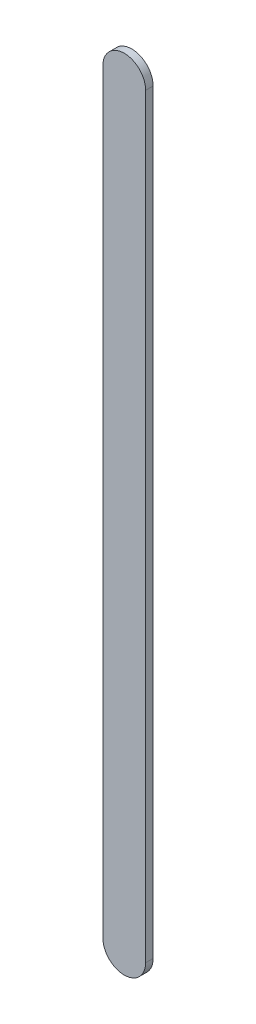
ISO-10303-21;
HEADER;
FILE_DESCRIPTION(('STEP AP214'),'2;1');
FILE_NAME('part.step','',(''),(''),'','','');
FILE_SCHEMA(('AUTOMOTIVE_DESIGN { 1 0 10303 214 1 1 1 1 }'));
ENDSEC;
DATA;
#1=APPLICATION_CONTEXT('core data for automotive mechanical design processes');
#2=APPLICATION_PROTOCOL_DEFINITION('international standard','automotive_design',2000,#1);
#3=PRODUCT_CONTEXT('',#1,'mechanical');
#4=PRODUCT('Part','Part','',(#3));
#5=PRODUCT_RELATED_PRODUCT_CATEGORY('part','',(#4));
#6=PRODUCT_DEFINITION_FORMATION('','',#4);
#7=PRODUCT_DEFINITION_CONTEXT('part definition',#1,'design');
#8=PRODUCT_DEFINITION('design','',#6,#7);
#9=PRODUCT_DEFINITION_SHAPE('','',#8);
#10=(LENGTH_UNIT() NAMED_UNIT(*) SI_UNIT(.MILLI.,.METRE.));
#11=(NAMED_UNIT(*) PLANE_ANGLE_UNIT() SI_UNIT($,.RADIAN.));
#12=(NAMED_UNIT(*) SI_UNIT($,.STERADIAN.) SOLID_ANGLE_UNIT());
#13=UNCERTAINTY_MEASURE_WITH_UNIT(LENGTH_MEASURE(1.E-05),#10,'distance_accuracy_value','');
#14=(GEOMETRIC_REPRESENTATION_CONTEXT(3) GLOBAL_UNCERTAINTY_ASSIGNED_CONTEXT((#13)) GLOBAL_UNIT_ASSIGNED_CONTEXT((#10,
#11,#12)) REPRESENTATION_CONTEXT('',''));
#15=CARTESIAN_POINT('',(0.,0.,0.));
#16=DIRECTION('',(0.,0.,1.));
#17=DIRECTION('',(1.,0.,0.));
#18=AXIS2_PLACEMENT_3D('',#15,#16,#17);
#19=CARTESIAN_POINT('',(93.55,-123.582233,1.635));
#20=DIRECTION('',(0.,0.,1.));
#21=DIRECTION('',(1.,0.,0.));
#22=AXIS2_PLACEMENT_3D('',#19,#20,#21);
#23=PLANE('',#22);
#24=DIRECTION('',(0.,1.,0.));
#25=VECTOR('',#24,1.);
#26=CARTESIAN_POINT('',(93.55,-123.582233,1.635));
#27=LINE('',#26,#25);
#28=CARTESIAN_POINT('',(93.55,-123.582233,1.635));
#29=VERTEX_POINT('',#28);
#30=CARTESIAN_POINT('',(93.55,-120.05,1.635));
#31=VERTEX_POINT('',#30);
#32=EDGE_CURVE('E71',#29,#31,#27,.T.);
#33=ORIENTED_EDGE('',*,*,#32,.T.);
#34=CARTESIAN_POINT('',(93.45,-120.05,1.635));
#35=DIRECTION('',(0.,0.,1.));
#36=DIRECTION('',(1.,0.,0.));
#37=AXIS2_PLACEMENT_3D('',#34,#35,#36);
#38=CIRCLE('',#37,0.1);
#39=CARTESIAN_POINT('',(93.35,-120.05,1.635));
#40=VERTEX_POINT('',#39);
#41=EDGE_CURVE('E105',#31,#40,#38,.T.);
#42=ORIENTED_EDGE('',*,*,#41,.T.);
#43=DIRECTION('',(0.,-1.,0.));
#44=VECTOR('',#43,1.);
#45=CARTESIAN_POINT('',(93.35,-120.05,1.635));
#46=LINE('',#45,#44);
#47=CARTESIAN_POINT('',(93.35,-123.582233,1.635));
#48=VERTEX_POINT('',#47);
#49=EDGE_CURVE('E73',#40,#48,#46,.T.);
#50=ORIENTED_EDGE('',*,*,#49,.T.);
#51=CARTESIAN_POINT('',(93.45,-123.582233,1.635));
#52=DIRECTION('',(0.,0.,1.));
#53=DIRECTION('',(-1.,0.,0.));
#54=AXIS2_PLACEMENT_3D('',#51,#52,#53);
#55=CIRCLE('',#54,0.1);
#56=EDGE_CURVE('E11',#48,#29,#55,.T.);
#57=ORIENTED_EDGE('',*,*,#56,.T.);
#58=EDGE_LOOP('',(#33,#42,#50,#57));
#59=FACE_BOUND('',#58,.T.);
#60=ADVANCED_FACE('F17',(#59),#23,.T.);
#61=CARTESIAN_POINT('',(93.55,-123.582233,1.6));
#62=DIRECTION('',(0.,0.,1.));
#63=DIRECTION('',(1.,0.,0.));
#64=AXIS2_PLACEMENT_3D('',#61,#62,#63);
#65=PLANE('',#64);
#66=CARTESIAN_POINT('',(93.45,-123.582233,1.6));
#67=DIRECTION('',(0.,0.,1.));
#68=DIRECTION('',(-1.,0.,0.));
#69=AXIS2_PLACEMENT_3D('',#66,#67,#68);
#70=CIRCLE('',#69,0.1);
#71=CARTESIAN_POINT('',(93.35,-123.582233,1.6));
#72=VERTEX_POINT('',#71);
#73=CARTESIAN_POINT('',(93.55,-123.582233,1.6));
#74=VERTEX_POINT('',#73);
#75=EDGE_CURVE('E26',#72,#74,#70,.T.);
#76=ORIENTED_EDGE('',*,*,#75,.F.);
#77=DIRECTION('',(0.,-1.,0.));
#78=VECTOR('',#77,1.);
#79=CARTESIAN_POINT('',(93.35,-120.05,1.6));
#80=LINE('',#79,#78);
#81=CARTESIAN_POINT('',(93.35,-120.05,1.6));
#82=VERTEX_POINT('',#81);
#83=EDGE_CURVE('E109',#82,#72,#80,.T.);
#84=ORIENTED_EDGE('',*,*,#83,.F.);
#85=CARTESIAN_POINT('',(93.45,-120.05,1.6));
#86=DIRECTION('',(0.,0.,1.));
#87=DIRECTION('',(1.,0.,0.));
#88=AXIS2_PLACEMENT_3D('',#85,#86,#87);
#89=CIRCLE('',#88,0.1);
#90=CARTESIAN_POINT('',(93.55,-120.05,1.6));
#91=VERTEX_POINT('',#90);
#92=EDGE_CURVE('E81',#91,#82,#89,.T.);
#93=ORIENTED_EDGE('',*,*,#92,.F.);
#94=DIRECTION('',(0.,1.,0.));
#95=VECTOR('',#94,1.);
#96=CARTESIAN_POINT('',(93.55,-123.582233,1.6));
#97=LINE('',#96,#95);
#98=EDGE_CURVE('E92',#74,#91,#97,.T.);
#99=ORIENTED_EDGE('',*,*,#98,.F.);
#100=EDGE_LOOP('',(#76,#84,#93,#99));
#101=FACE_BOUND('',#100,.T.);
#102=ADVANCED_FACE('F19',(#101),#65,.F.);
#103=CARTESIAN_POINT('',(93.45,-123.582233,1.6));
#104=DIRECTION('',(0.,0.,-1.));
#105=DIRECTION('',(-1.,0.,0.));
#106=AXIS2_PLACEMENT_3D('',#103,#104,#105);
#107=CYLINDRICAL_SURFACE('',#106,0.1);
#108=ORIENTED_EDGE('',*,*,#75,.T.);
#109=DIRECTION('',(0.,0.,1.));
#110=VECTOR('',#109,1.);
#111=CARTESIAN_POINT('',(93.55,-123.582233,1.6));
#112=LINE('',#111,#110);
#113=EDGE_CURVE('E76',#74,#29,#112,.T.);
#114=ORIENTED_EDGE('',*,*,#113,.T.);
#115=ORIENTED_EDGE('',*,*,#56,.F.);
#116=DIRECTION('',(0.,0.,1.));
#117=VECTOR('',#116,1.);
#118=CARTESIAN_POINT('',(93.35,-123.582233,1.6));
#119=LINE('',#118,#117);
#120=EDGE_CURVE('E108',#72,#48,#119,.T.);
#121=ORIENTED_EDGE('',*,*,#120,.F.);
#122=EDGE_LOOP('',(#108,#114,#115,#121));
#123=FACE_BOUND('',#122,.T.);
#124=ADVANCED_FACE('F77',(#123),#107,.T.);
#125=CARTESIAN_POINT('',(93.35,-120.05,1.6));
#126=DIRECTION('',(1.,0.,0.));
#127=DIRECTION('',(0.,1.,0.));
#128=AXIS2_PLACEMENT_3D('',#125,#126,#127);
#129=PLANE('',#128);
#130=ORIENTED_EDGE('',*,*,#83,.T.);
#131=ORIENTED_EDGE('',*,*,#120,.T.);
#132=ORIENTED_EDGE('',*,*,#49,.F.);
#133=DIRECTION('',(0.,0.,1.));
#134=VECTOR('',#133,1.);
#135=CARTESIAN_POINT('',(93.35,-120.05,1.6));
#136=LINE('',#135,#134);
#137=EDGE_CURVE('E99',#82,#40,#136,.T.);
#138=ORIENTED_EDGE('',*,*,#137,.F.);
#139=EDGE_LOOP('',(#130,#131,#132,#138));
#140=FACE_BOUND('',#139,.T.);
#141=ADVANCED_FACE('F116',(#140),#129,.F.);
#142=CARTESIAN_POINT('',(93.45,-120.05,1.6));
#143=DIRECTION('',(0.,0.,-1.));
#144=DIRECTION('',(1.,0.,0.));
#145=AXIS2_PLACEMENT_3D('',#142,#143,#144);
#146=CYLINDRICAL_SURFACE('',#145,0.1);
#147=ORIENTED_EDGE('',*,*,#92,.T.);
#148=ORIENTED_EDGE('',*,*,#137,.T.);
#149=ORIENTED_EDGE('',*,*,#41,.F.);
#150=DIRECTION('',(0.,0.,1.));
#151=VECTOR('',#150,1.);
#152=CARTESIAN_POINT('',(93.55,-120.05,1.6));
#153=LINE('',#152,#151);
#154=EDGE_CURVE('E85',#91,#31,#153,.T.);
#155=ORIENTED_EDGE('',*,*,#154,.F.);
#156=EDGE_LOOP('',(#147,#148,#149,#155));
#157=FACE_BOUND('',#156,.T.);
#158=ADVANCED_FACE('F119',(#157),#146,.T.);
#159=CARTESIAN_POINT('',(93.55,-123.582233,1.6));
#160=DIRECTION('',(-1.,0.,0.));
#161=DIRECTION('',(0.,0.,1.));
#162=AXIS2_PLACEMENT_3D('',#159,#160,#161);
#163=PLANE('',#162);
#164=ORIENTED_EDGE('',*,*,#98,.T.);
#165=ORIENTED_EDGE('',*,*,#154,.T.);
#166=ORIENTED_EDGE('',*,*,#32,.F.);
#167=ORIENTED_EDGE('',*,*,#113,.F.);
#168=EDGE_LOOP('',(#164,#165,#166,#167));
#169=FACE_BOUND('',#168,.T.);
#170=ADVANCED_FACE('F83',(#169),#163,.F.);
#171=CLOSED_SHELL('',(#60,#102,#124,#141,#158,#170));
#172=MANIFOLD_SOLID_BREP('B1',#171);
#173=ADVANCED_BREP_SHAPE_REPRESENTATION('',(#18,#172),#14);
#174=SHAPE_DEFINITION_REPRESENTATION(#9,#173);
ENDSEC;
END-ISO-10303-21;
